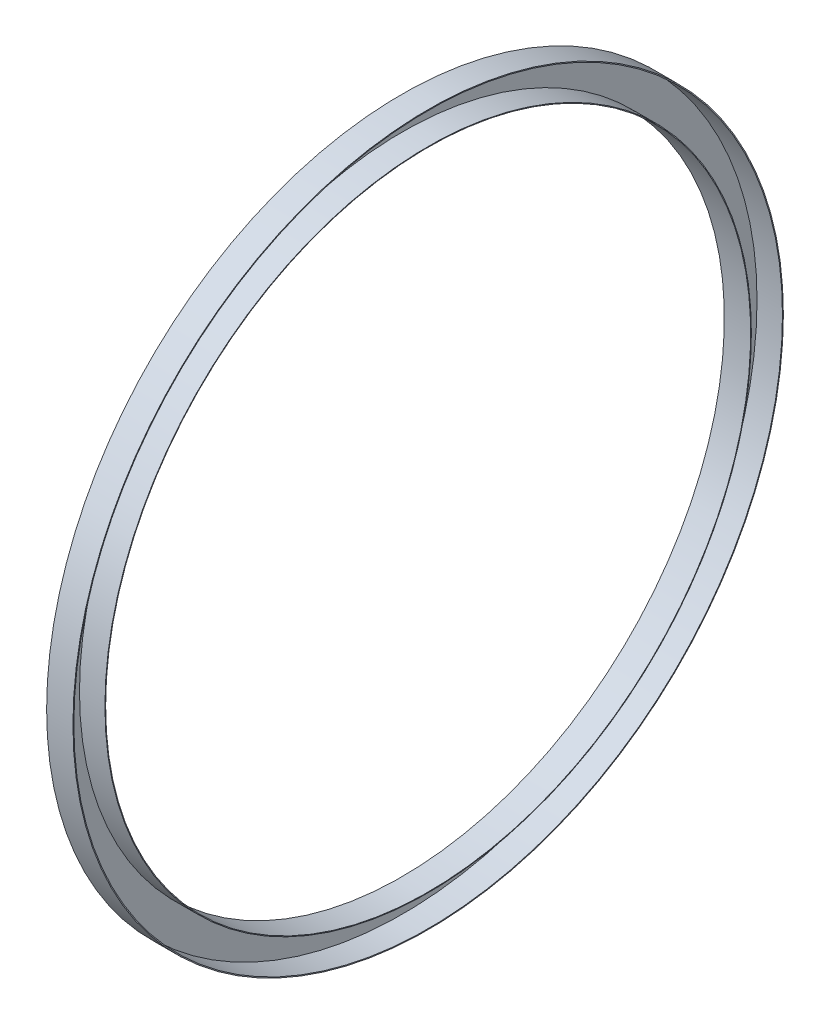
ISO-10303-21;
HEADER;
FILE_DESCRIPTION(('STEP AP214'),'2;1');
FILE_NAME('part.step','',(''),(''),'','','');
FILE_SCHEMA(('AUTOMOTIVE_DESIGN { 1 0 10303 214 1 1 1 1 }'));
ENDSEC;
DATA;
#1=APPLICATION_CONTEXT('core data for automotive mechanical design processes');
#2=APPLICATION_PROTOCOL_DEFINITION('international standard','automotive_design',2000,#1);
#3=PRODUCT_CONTEXT('',#1,'mechanical');
#4=PRODUCT('Part','Part','',(#3));
#5=PRODUCT_RELATED_PRODUCT_CATEGORY('part','',(#4));
#6=PRODUCT_DEFINITION_FORMATION('','',#4);
#7=PRODUCT_DEFINITION_CONTEXT('part definition',#1,'design');
#8=PRODUCT_DEFINITION('design','',#6,#7);
#9=PRODUCT_DEFINITION_SHAPE('','',#8);
#10=(LENGTH_UNIT() NAMED_UNIT(*) SI_UNIT(.MILLI.,.METRE.));
#11=(NAMED_UNIT(*) PLANE_ANGLE_UNIT() SI_UNIT($,.RADIAN.));
#12=(NAMED_UNIT(*) SI_UNIT($,.STERADIAN.) SOLID_ANGLE_UNIT());
#13=UNCERTAINTY_MEASURE_WITH_UNIT(LENGTH_MEASURE(1.E-05),#10,'distance_accuracy_value','');
#14=(GEOMETRIC_REPRESENTATION_CONTEXT(3) GLOBAL_UNCERTAINTY_ASSIGNED_CONTEXT((#13)) GLOBAL_UNIT_ASSIGNED_CONTEXT((#10,
#11,#12)) REPRESENTATION_CONTEXT('',''));
#15=CARTESIAN_POINT('',(0.,0.,0.));
#16=DIRECTION('',(0.,0.,1.));
#17=DIRECTION('',(1.,0.,0.));
#18=AXIS2_PLACEMENT_3D('',#15,#16,#17);
#19=CARTESIAN_POINT('',(-23.0899363728027,0.,-4.86351955138517E-12));
#20=DIRECTION('',(1.,0.,0.));
#21=DIRECTION('',(0.,0.,-1.));
#22=AXIS2_PLACEMENT_3D('',#19,#20,#21);
#23=PLANE('',#22);
#24=CARTESIAN_POINT('',(-23.0899363728024,0.,-4.86351955138517E-12));
#25=DIRECTION('',(-1.,0.,0.));
#26=DIRECTION('',(0.,0.,1.));
#27=AXIS2_PLACEMENT_3D('',#24,#25,#26);
#28=CIRCLE('',#27,1123.00767782499);
#29=CARTESIAN_POINT('',(-23.0899363728024,0.,1123.00767782499));
#30=VERTEX_POINT('',#29);
#31=EDGE_CURVE('E67',#30,#30,#28,.T.);
#32=ORIENTED_EDGE('',*,*,#31,.T.);
#33=EDGE_LOOP('',(#32));
#34=FACE_BOUND('',#33,.T.);
#35=CARTESIAN_POINT('',(-23.0899363728031,0.,-4.86351955138517E-12));
#36=DIRECTION('',(-1.,0.,0.));
#37=DIRECTION('',(0.,0.,1.));
#38=AXIS2_PLACEMENT_3D('',#35,#36,#37);
#39=CIRCLE('',#38,1230.94087312345);
#40=CARTESIAN_POINT('',(-23.0899363728031,0.,1230.94087312345));
#41=VERTEX_POINT('',#40);
#42=EDGE_CURVE('E10',#41,#41,#39,.T.);
#43=ORIENTED_EDGE('',*,*,#42,.F.);
#44=EDGE_LOOP('',(#43));
#45=FACE_BOUND('',#44,.T.);
#46=ADVANCED_FACE('F39',(#34,#45),#23,.T.);
#47=CARTESIAN_POINT('',(-3590.81629212557,0.,-4.86351955138517E-12));
#48=DIRECTION('',(-1.,0.,0.));
#49=DIRECTION('',(0.,0.,1.));
#50=AXIS2_PLACEMENT_3D('',#47,#48,#49);
#51=CYLINDRICAL_SURFACE('',#50,1230.94087312345);
#52=ORIENTED_EDGE('',*,*,#42,.T.);
#53=EDGE_LOOP('',(#52));
#54=FACE_BOUND('',#53,.T.);
#55=CARTESIAN_POINT('',(65.2772857955509,0.,-4.86351955138517E-12));
#56=DIRECTION('',(-1.,0.,0.));
#57=DIRECTION('',(0.,0.,1.));
#58=AXIS2_PLACEMENT_3D('',#55,#56,#57);
#59=CIRCLE('',#58,1230.94087312345);
#60=CARTESIAN_POINT('',(65.2772857955509,0.,1230.94087312345));
#61=VERTEX_POINT('',#60);
#62=EDGE_CURVE('E45',#61,#61,#59,.T.);
#63=ORIENTED_EDGE('',*,*,#62,.F.);
#64=EDGE_LOOP('',(#63));
#65=FACE_BOUND('',#64,.T.);
#66=ADVANCED_FACE('F91',(#54,#65),#51,.F.);
#67=CARTESIAN_POINT('',(65.2772857955508,0.,-4.86351955138517E-12));
#68=DIRECTION('',(1.,0.,0.));
#69=DIRECTION('',(0.,0.,-1.));
#70=AXIS2_PLACEMENT_3D('',#67,#68,#69);
#71=PLANE('',#70);
#72=ORIENTED_EDGE('',*,*,#62,.T.);
#73=EDGE_LOOP('',(#72));
#74=FACE_BOUND('',#73,.T.);
#75=CARTESIAN_POINT('',(65.2772857955509,0.,-4.86351955138517E-12));
#76=DIRECTION('',(-1.,0.,0.));
#77=DIRECTION('',(0.,0.,1.));
#78=AXIS2_PLACEMENT_3D('',#75,#76,#77);
#79=CIRCLE('',#78,1234.11537886752);
#80=CARTESIAN_POINT('',(65.2772857955509,0.,1234.11537886752));
#81=VERTEX_POINT('',#80);
#82=EDGE_CURVE('E49',#81,#81,#79,.T.);
#83=ORIENTED_EDGE('',*,*,#82,.F.);
#84=EDGE_LOOP('',(#83));
#85=FACE_BOUND('',#84,.T.);
#86=ADVANCED_FACE('F95',(#74,#85),#71,.T.);
#87=CARTESIAN_POINT('',(-3590.81629212557,0.,-4.86351955138517E-12));
#88=DIRECTION('',(-1.,0.,0.));
#89=DIRECTION('',(0.,0.,1.));
#90=AXIS2_PLACEMENT_3D('',#87,#88,#89);
#91=CYLINDRICAL_SURFACE('',#90,1234.11537886752);
#92=ORIENTED_EDGE('',*,*,#82,.T.);
#93=EDGE_LOOP('',(#92));
#94=FACE_BOUND('',#93,.T.);
#95=CARTESIAN_POINT('',(-26.1627142044492,0.,-4.86351955138517E-12));
#96=DIRECTION('',(-1.,0.,0.));
#97=DIRECTION('',(0.,0.,1.));
#98=AXIS2_PLACEMENT_3D('',#95,#96,#97);
#99=CIRCLE('',#98,1234.11537886752);
#100=CARTESIAN_POINT('',(-26.1627142044492,0.,1234.11537886752));
#101=VERTEX_POINT('',#100);
#102=EDGE_CURVE('E53',#101,#101,#99,.T.);
#103=ORIENTED_EDGE('',*,*,#102,.F.);
#104=EDGE_LOOP('',(#103));
#105=FACE_BOUND('',#104,.T.);
#106=ADVANCED_FACE('F99',(#94,#105),#91,.T.);
#107=CARTESIAN_POINT('',(-26.1627142044492,0.,-4.86351955138517E-12));
#108=DIRECTION('',(1.,0.,0.));
#109=DIRECTION('',(0.,0.,-1.));
#110=AXIS2_PLACEMENT_3D('',#107,#108,#109);
#111=PLANE('',#110);
#112=CARTESIAN_POINT('',(-26.1627142044492,0.,-4.86351955138517E-12));
#113=DIRECTION('',(-1.,0.,0.));
#114=DIRECTION('',(0.,0.,1.));
#115=AXIS2_PLACEMENT_3D('',#112,#113,#114);
#116=CIRCLE('',#115,1120.51342331179);
#117=CARTESIAN_POINT('',(-26.1627142044492,0.,1120.51342331179));
#118=VERTEX_POINT('',#117);
#119=EDGE_CURVE('E58',#118,#118,#116,.T.);
#120=ORIENTED_EDGE('',*,*,#119,.F.);
#121=EDGE_LOOP('',(#120));
#122=FACE_BOUND('',#121,.T.);
#123=ORIENTED_EDGE('',*,*,#102,.T.);
#124=EDGE_LOOP('',(#123));
#125=FACE_BOUND('',#124,.T.);
#126=ADVANCED_FACE('F87',(#122,#125),#111,.F.);
#127=CARTESIAN_POINT('',(-3590.81629212557,0.,-4.86351955138517E-12));
#128=DIRECTION('',(-1.,0.,0.));
#129=DIRECTION('',(0.,0.,1.));
#130=AXIS2_PLACEMENT_3D('',#127,#128,#129);
#131=CYLINDRICAL_SURFACE('',#130,1120.51342331179);
#132=CARTESIAN_POINT('',(65.2772857955509,0.,-4.86351955138517E-12));
#133=DIRECTION('',(-1.,0.,0.));
#134=DIRECTION('',(0.,0.,1.));
#135=AXIS2_PLACEMENT_3D('',#132,#133,#134);
#136=CIRCLE('',#135,1120.51342331179);
#137=CARTESIAN_POINT('',(65.2772857955509,0.,1120.51342331179));
#138=VERTEX_POINT('',#137);
#139=EDGE_CURVE('E61',#138,#138,#136,.T.);
#140=ORIENTED_EDGE('',*,*,#139,.F.);
#141=EDGE_LOOP('',(#140));
#142=FACE_BOUND('',#141,.T.);
#143=ORIENTED_EDGE('',*,*,#119,.T.);
#144=EDGE_LOOP('',(#143));
#145=FACE_BOUND('',#144,.T.);
#146=ADVANCED_FACE('F81',(#142,#145),#131,.F.);
#147=CARTESIAN_POINT('',(65.2772857955508,3.81572402825498E-13,-4.86351955138517E-12));
#148=DIRECTION('',(1.,0.,0.));
#149=DIRECTION('',(0.,0.,-1.));
#150=AXIS2_PLACEMENT_3D('',#147,#148,#149);
#151=PLANE('',#150);
#152=ORIENTED_EDGE('',*,*,#139,.T.);
#153=EDGE_LOOP('',(#152));
#154=FACE_BOUND('',#153,.T.);
#155=CARTESIAN_POINT('',(65.2772857955509,0.,-4.86351955138517E-12));
#156=DIRECTION('',(-1.,0.,0.));
#157=DIRECTION('',(0.,0.,1.));
#158=AXIS2_PLACEMENT_3D('',#155,#156,#157);
#159=CIRCLE('',#158,1123.00767782499);
#160=CARTESIAN_POINT('',(65.2772857955509,0.,1123.00767782499));
#161=VERTEX_POINT('',#160);
#162=EDGE_CURVE('E64',#161,#161,#159,.T.);
#163=ORIENTED_EDGE('',*,*,#162,.F.);
#164=EDGE_LOOP('',(#163));
#165=FACE_BOUND('',#164,.T.);
#166=ADVANCED_FACE('F76',(#154,#165),#151,.T.);
#167=CARTESIAN_POINT('',(-3590.81629212557,0.,-4.86351955138517E-12));
#168=DIRECTION('',(-1.,0.,0.));
#169=DIRECTION('',(0.,0.,1.));
#170=AXIS2_PLACEMENT_3D('',#167,#168,#169);
#171=CYLINDRICAL_SURFACE('',#170,1123.00767782499);
#172=ORIENTED_EDGE('',*,*,#31,.F.);
#173=EDGE_LOOP('',(#172));
#174=FACE_BOUND('',#173,.T.);
#175=ORIENTED_EDGE('',*,*,#162,.T.);
#176=EDGE_LOOP('',(#175));
#177=FACE_BOUND('',#176,.T.);
#178=ADVANCED_FACE('F73',(#174,#177),#171,.T.);
#179=CLOSED_SHELL('',(#46,#66,#86,#106,#126,#146,#166,#178));
#180=MANIFOLD_SOLID_BREP('B2',#179);
#181=ADVANCED_BREP_SHAPE_REPRESENTATION('',(#18,#180),#14);
#182=SHAPE_DEFINITION_REPRESENTATION(#9,#181);
ENDSEC;
END-ISO-10303-21;
